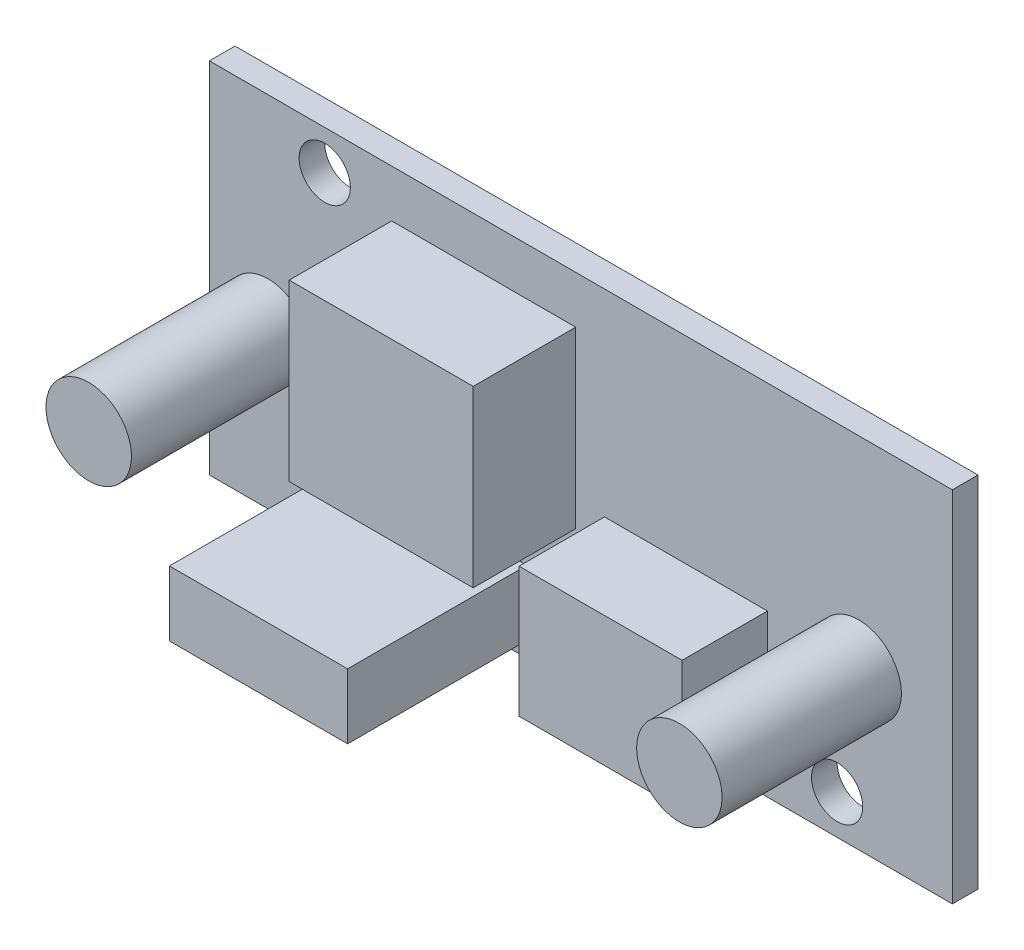
ISO-10303-21;
HEADER;
FILE_DESCRIPTION(('STEP AP214'),'2;1');
FILE_NAME('part.step','',(''),(''),'','','');
FILE_SCHEMA(('AUTOMOTIVE_DESIGN { 1 0 10303 214 1 1 1 1 }'));
ENDSEC;
DATA;
#1=APPLICATION_CONTEXT('core data for automotive mechanical design processes');
#2=APPLICATION_PROTOCOL_DEFINITION('international standard','automotive_design',2000,#1);
#3=PRODUCT_CONTEXT('',#1,'mechanical');
#4=PRODUCT('Part','Part','',(#3));
#5=PRODUCT_RELATED_PRODUCT_CATEGORY('part','',(#4));
#6=PRODUCT_DEFINITION_FORMATION('','',#4);
#7=PRODUCT_DEFINITION_CONTEXT('part definition',#1,'design');
#8=PRODUCT_DEFINITION('design','',#6,#7);
#9=PRODUCT_DEFINITION_SHAPE('','',#8);
#10=(LENGTH_UNIT() NAMED_UNIT(*) SI_UNIT(.MILLI.,.METRE.));
#11=(NAMED_UNIT(*) PLANE_ANGLE_UNIT() SI_UNIT($,.RADIAN.));
#12=(NAMED_UNIT(*) SI_UNIT($,.STERADIAN.) SOLID_ANGLE_UNIT());
#13=UNCERTAINTY_MEASURE_WITH_UNIT(LENGTH_MEASURE(1.E-05),#10,'distance_accuracy_value','');
#14=(GEOMETRIC_REPRESENTATION_CONTEXT(3) GLOBAL_UNCERTAINTY_ASSIGNED_CONTEXT((#13)) GLOBAL_UNIT_ASSIGNED_CONTEXT((#10,
#11,#12)) REPRESENTATION_CONTEXT('',''));
#15=CARTESIAN_POINT('',(0.,0.,0.));
#16=DIRECTION('',(0.,0.,1.));
#17=DIRECTION('',(1.,0.,0.));
#18=AXIS2_PLACEMENT_3D('',#15,#16,#17);
#19=CARTESIAN_POINT('',(0.,0.,1.5));
#20=DIRECTION('',(0.,0.,-1.));
#21=DIRECTION('',(-1.,0.,0.));
#22=AXIS2_PLACEMENT_3D('',#19,#20,#21);
#23=PLANE('',#22);
#24=DIRECTION('',(0.,-1.,0.));
#25=VECTOR('',#24,1.);
#26=CARTESIAN_POINT('',(10.6723495965989,18.2175320677435,1.5));
#27=LINE('',#26,#25);
#28=CARTESIAN_POINT('',(10.6723495965989,18.2175320677435,1.5));
#29=VERTEX_POINT('',#28);
#30=CARTESIAN_POINT('',(10.6723495965989,7.99909000588036,1.5));
#31=VERTEX_POINT('',#30);
#32=EDGE_CURVE('E169',#29,#31,#27,.T.);
#33=ORIENTED_EDGE('',*,*,#32,.F.);
#34=DIRECTION('',(-1.,0.,0.));
#35=VECTOR('',#34,1.);
#36=CARTESIAN_POINT('',(10.6723495965989,18.2175320677435,1.5));
#37=LINE('',#36,#35);
#38=CARTESIAN_POINT('',(21.4431398780221,18.2175320677435,1.5));
#39=VERTEX_POINT('',#38);
#40=EDGE_CURVE('E182',#39,#29,#37,.T.);
#41=ORIENTED_EDGE('',*,*,#40,.F.);
#42=DIRECTION('',(0.,1.,0.));
#43=VECTOR('',#42,1.);
#44=CARTESIAN_POINT('',(21.4431398780221,18.2175320677435,1.5));
#45=LINE('',#44,#43);
#46=CARTESIAN_POINT('',(21.4431398780221,7.99909000588036,1.5));
#47=VERTEX_POINT('',#46);
#48=EDGE_CURVE('E191',#47,#39,#45,.T.);
#49=ORIENTED_EDGE('',*,*,#48,.F.);
#50=DIRECTION('',(1.,0.,0.));
#51=VECTOR('',#50,1.);
#52=CARTESIAN_POINT('',(10.6723495965989,7.99909000588036,1.5));
#53=LINE('',#52,#51);
#54=EDGE_CURVE('E172',#31,#47,#53,.T.);
#55=ORIENTED_EDGE('',*,*,#54,.F.);
#56=EDGE_LOOP('',(#33,#41,#49,#55));
#57=FACE_BOUND('',#56,.T.);
#58=CARTESIAN_POINT('',(3.4304507179211,9.16515846939627,1.5));
#59=DIRECTION('',(0.,0.,-1.));
#60=DIRECTION('',(-1.,0.,0.));
#61=AXIS2_PLACEMENT_3D('',#58,#59,#60);
#62=CIRCLE('',#61,2.5);
#63=CARTESIAN_POINT('',(0.930450717921095,9.16515846939627,1.5));
#64=VERTEX_POINT('',#63);
#65=EDGE_CURVE('E43',#64,#64,#62,.F.);
#66=ORIENTED_EDGE('',*,*,#65,.F.);
#67=EDGE_LOOP('',(#66));
#68=FACE_BOUND('',#67,.T.);
#69=CARTESIAN_POINT('',(36.75,2.3,1.5));
#70=DIRECTION('',(0.,0.,1.));
#71=DIRECTION('',(1.,0.,0.));
#72=AXIS2_PLACEMENT_3D('',#69,#70,#71);
#73=CIRCLE('',#72,1.5);
#74=CARTESIAN_POINT('',(38.25,2.3,1.5));
#75=VERTEX_POINT('',#74);
#76=EDGE_CURVE('E247',#75,#75,#73,.T.);
#77=ORIENTED_EDGE('',*,*,#76,.F.);
#78=EDGE_LOOP('',(#77));
#79=FACE_BOUND('',#78,.T.);
#80=DIRECTION('',(0.,-1.,0.));
#81=VECTOR('',#80,1.);
#82=CARTESIAN_POINT('',(0.,0.,1.5));
#83=LINE('',#82,#81);
#84=CARTESIAN_POINT('',(0.,21.,1.5));
#85=VERTEX_POINT('',#84);
#86=CARTESIAN_POINT('',(0.,0.,1.5));
#87=VERTEX_POINT('',#86);
#88=EDGE_CURVE('E259',#85,#87,#83,.T.);
#89=ORIENTED_EDGE('',*,*,#88,.T.);
#90=DIRECTION('',(1.,0.,0.));
#91=VECTOR('',#90,1.);
#92=CARTESIAN_POINT('',(0.,0.,1.5));
#93=LINE('',#92,#91);
#94=CARTESIAN_POINT('',(43.5,0.,1.5));
#95=VERTEX_POINT('',#94);
#96=EDGE_CURVE('E262',#87,#95,#93,.T.);
#97=ORIENTED_EDGE('',*,*,#96,.T.);
#98=DIRECTION('',(0.,1.,0.));
#99=VECTOR('',#98,1.);
#100=CARTESIAN_POINT('',(43.5,0.,1.5));
#101=LINE('',#100,#99);
#102=CARTESIAN_POINT('',(43.5,21.,1.5));
#103=VERTEX_POINT('',#102);
#104=EDGE_CURVE('E265',#95,#103,#101,.T.);
#105=ORIENTED_EDGE('',*,*,#104,.T.);
#106=DIRECTION('',(-1.,0.,0.));
#107=VECTOR('',#106,1.);
#108=CARTESIAN_POINT('',(0.,21.,1.5));
#109=LINE('',#108,#107);
#110=EDGE_CURVE('E267',#103,#85,#109,.T.);
#111=ORIENTED_EDGE('',*,*,#110,.T.);
#112=EDGE_LOOP('',(#89,#97,#105,#111));
#113=FACE_BOUND('',#112,.T.);
#114=CARTESIAN_POINT('',(6.75,18.7,1.5));
#115=DIRECTION('',(0.,0.,1.));
#116=DIRECTION('',(1.,0.,0.));
#117=AXIS2_PLACEMENT_3D('',#114,#115,#116);
#118=CIRCLE('',#117,1.5);
#119=CARTESIAN_POINT('',(8.25,18.7,1.5));
#120=VERTEX_POINT('',#119);
#121=EDGE_CURVE('E253',#120,#120,#118,.T.);
#122=ORIENTED_EDGE('',*,*,#121,.F.);
#123=EDGE_LOOP('',(#122));
#124=FACE_BOUND('',#123,.T.);
#125=DIRECTION('',(0.,-1.,0.));
#126=VECTOR('',#125,1.);
#127=CARTESIAN_POINT('',(8.15609659638031,0.910621188191537,1.5));
#128=LINE('',#127,#126);
#129=CARTESIAN_POINT('',(8.15609659638031,4.71568670071714,1.5));
#130=VERTEX_POINT('',#129);
#131=CARTESIAN_POINT('',(8.15609659638031,0.910621188191537,1.5));
#132=VERTEX_POINT('',#131);
#133=EDGE_CURVE('E213',#130,#132,#128,.T.);
#134=ORIENTED_EDGE('',*,*,#133,.F.);
#135=DIRECTION('',(-1.,0.,0.));
#136=VECTOR('',#135,1.);
#137=CARTESIAN_POINT('',(8.15609659638031,4.71568670071714,1.5));
#138=LINE('',#137,#136);
#139=CARTESIAN_POINT('',(18.5893407436279,4.71568670071714,1.5));
#140=VERTEX_POINT('',#139);
#141=EDGE_CURVE('E218',#140,#130,#138,.T.);
#142=ORIENTED_EDGE('',*,*,#141,.F.);
#143=DIRECTION('',(0.,1.,0.));
#144=VECTOR('',#143,1.);
#145=CARTESIAN_POINT('',(18.5893407436279,0.910621188191537,1.5));
#146=LINE('',#145,#144);
#147=CARTESIAN_POINT('',(18.5893407436279,0.910621188191537,1.5));
#148=VERTEX_POINT('',#147);
#149=EDGE_CURVE('E230',#148,#140,#146,.T.);
#150=ORIENTED_EDGE('',*,*,#149,.F.);
#151=DIRECTION('',(1.,0.,0.));
#152=VECTOR('',#151,1.);
#153=CARTESIAN_POINT('',(8.15609659638031,0.910621188191537,1.5));
#154=LINE('',#153,#152);
#155=EDGE_CURVE('E227',#132,#148,#154,.T.);
#156=ORIENTED_EDGE('',*,*,#155,.F.);
#157=EDGE_LOOP('',(#134,#142,#150,#156));
#158=FACE_BOUND('',#157,.T.);
#159=CARTESIAN_POINT('',(38.0135864648272,9.16515846939627,1.5));
#160=DIRECTION('',(0.,0.,-1.));
#161=DIRECTION('',(-1.,0.,0.));
#162=AXIS2_PLACEMENT_3D('',#159,#160,#161);
#163=CIRCLE('',#162,2.5);
#164=CARTESIAN_POINT('',(35.5135864648272,9.16515846939627,1.5));
#165=VERTEX_POINT('',#164);
#166=EDGE_CURVE('E11',#165,#165,#163,.F.);
#167=ORIENTED_EDGE('',*,*,#166,.F.);
#168=EDGE_LOOP('',(#167));
#169=FACE_BOUND('',#168,.T.);
#170=DIRECTION('',(0.,-1.,0.));
#171=VECTOR('',#170,1.);
#172=CARTESIAN_POINT('',(23.1308705489004,9.44133257917635,1.5));
#173=LINE('',#172,#171);
#174=CARTESIAN_POINT('',(23.1308705489004,9.44133257917635,1.5));
#175=VERTEX_POINT('',#174);
#176=CARTESIAN_POINT('',(23.1308705489004,1.83120155412515,1.5));
#177=VERTEX_POINT('',#176);
#178=EDGE_CURVE('E168',#175,#177,#173,.T.);
#179=ORIENTED_EDGE('',*,*,#178,.F.);
#180=DIRECTION('',(-1.,0.,0.));
#181=VECTOR('',#180,1.);
#182=CARTESIAN_POINT('',(23.1308705489004,9.44133257917635,1.5));
#183=LINE('',#182,#181);
#184=CARTESIAN_POINT('',(32.6742203424122,9.44133257917635,1.5));
#185=VERTEX_POINT('',#184);
#186=EDGE_CURVE('E165',#185,#175,#183,.T.);
#187=ORIENTED_EDGE('',*,*,#186,.F.);
#188=DIRECTION('',(0.,1.,0.));
#189=VECTOR('',#188,1.);
#190=CARTESIAN_POINT('',(32.6742203424122,9.44133257917635,1.5));
#191=LINE('',#190,#189);
#192=CARTESIAN_POINT('',(32.6742203424122,1.83120155412515,1.5));
#193=VERTEX_POINT('',#192);
#194=EDGE_CURVE('E55',#193,#185,#191,.T.);
#195=ORIENTED_EDGE('',*,*,#194,.F.);
#196=DIRECTION('',(1.,0.,0.));
#197=VECTOR('',#196,1.);
#198=CARTESIAN_POINT('',(23.1308705489004,1.83120155412515,1.5));
#199=LINE('',#198,#197);
#200=EDGE_CURVE('E50',#177,#193,#199,.T.);
#201=ORIENTED_EDGE('',*,*,#200,.F.);
#202=EDGE_LOOP('',(#179,#187,#195,#201));
#203=FACE_BOUND('',#202,.T.);
#204=ADVANCED_FACE('F35',(#57,#68,#79,#113,#124,#158,#169,#203),#23,.F.);
#205=CARTESIAN_POINT('',(0.,0.,0.));
#206=DIRECTION('',(0.,0.,-1.));
#207=DIRECTION('',(-1.,0.,0.));
#208=AXIS2_PLACEMENT_3D('',#205,#206,#207);
#209=PLANE('',#208);
#210=CARTESIAN_POINT('',(6.75,18.7,0.));
#211=DIRECTION('',(0.,0.,1.));
#212=DIRECTION('',(1.,0.,0.));
#213=AXIS2_PLACEMENT_3D('',#210,#211,#212);
#214=CIRCLE('',#213,1.5);
#215=CARTESIAN_POINT('',(8.25,18.7,0.));
#216=VERTEX_POINT('',#215);
#217=EDGE_CURVE('E250',#216,#216,#214,.T.);
#218=ORIENTED_EDGE('',*,*,#217,.T.);
#219=EDGE_LOOP('',(#218));
#220=FACE_BOUND('',#219,.T.);
#221=DIRECTION('',(0.,-1.,0.));
#222=VECTOR('',#221,1.);
#223=CARTESIAN_POINT('',(0.,0.,0.));
#224=LINE('',#223,#222);
#225=CARTESIAN_POINT('',(0.,21.,0.));
#226=VERTEX_POINT('',#225);
#227=CARTESIAN_POINT('',(0.,0.,0.));
#228=VERTEX_POINT('',#227);
#229=EDGE_CURVE('E256',#226,#228,#224,.T.);
#230=ORIENTED_EDGE('',*,*,#229,.F.);
#231=DIRECTION('',(-1.,0.,0.));
#232=VECTOR('',#231,1.);
#233=CARTESIAN_POINT('',(0.,21.,0.));
#234=LINE('',#233,#232);
#235=CARTESIAN_POINT('',(43.5,21.,0.));
#236=VERTEX_POINT('',#235);
#237=EDGE_CURVE('E263',#236,#226,#234,.T.);
#238=ORIENTED_EDGE('',*,*,#237,.F.);
#239=DIRECTION('',(0.,1.,0.));
#240=VECTOR('',#239,1.);
#241=CARTESIAN_POINT('',(43.5,0.,0.));
#242=LINE('',#241,#240);
#243=CARTESIAN_POINT('',(43.5,0.,0.));
#244=VERTEX_POINT('',#243);
#245=EDGE_CURVE('E274',#244,#236,#242,.T.);
#246=ORIENTED_EDGE('',*,*,#245,.F.);
#247=DIRECTION('',(1.,0.,0.));
#248=VECTOR('',#247,1.);
#249=CARTESIAN_POINT('',(0.,0.,0.));
#250=LINE('',#249,#248);
#251=EDGE_CURVE('E272',#228,#244,#250,.T.);
#252=ORIENTED_EDGE('',*,*,#251,.F.);
#253=EDGE_LOOP('',(#230,#238,#246,#252));
#254=FACE_BOUND('',#253,.T.);
#255=CARTESIAN_POINT('',(36.75,2.3,0.));
#256=DIRECTION('',(0.,0.,1.));
#257=DIRECTION('',(1.,0.,0.));
#258=AXIS2_PLACEMENT_3D('',#255,#256,#257);
#259=CIRCLE('',#258,1.5);
#260=CARTESIAN_POINT('',(38.25,2.3,0.));
#261=VERTEX_POINT('',#260);
#262=EDGE_CURVE('E246',#261,#261,#259,.T.);
#263=ORIENTED_EDGE('',*,*,#262,.T.);
#264=EDGE_LOOP('',(#263));
#265=FACE_BOUND('',#264,.T.);
#266=ADVANCED_FACE('F294',(#220,#254,#265),#209,.T.);
#267=CARTESIAN_POINT('',(0.,0.,1.5));
#268=DIRECTION('',(1.,0.,0.));
#269=DIRECTION('',(0.,0.,-1.));
#270=AXIS2_PLACEMENT_3D('',#267,#268,#269);
#271=PLANE('',#270);
#272=ORIENTED_EDGE('',*,*,#229,.T.);
#273=DIRECTION('',(0.,0.,-1.));
#274=VECTOR('',#273,1.);
#275=CARTESIAN_POINT('',(0.,0.,1.5));
#276=LINE('',#275,#274);
#277=EDGE_CURVE('E285',#87,#228,#276,.T.);
#278=ORIENTED_EDGE('',*,*,#277,.F.);
#279=ORIENTED_EDGE('',*,*,#88,.F.);
#280=DIRECTION('',(0.,0.,-1.));
#281=VECTOR('',#280,1.);
#282=CARTESIAN_POINT('',(0.,21.,1.5));
#283=LINE('',#282,#281);
#284=EDGE_CURVE('E269',#85,#226,#283,.T.);
#285=ORIENTED_EDGE('',*,*,#284,.T.);
#286=EDGE_LOOP('',(#272,#278,#279,#285));
#287=FACE_BOUND('',#286,.T.);
#288=ADVANCED_FACE('F37',(#287),#271,.F.);
#289=CARTESIAN_POINT('',(0.,0.,1.5));
#290=DIRECTION('',(0.,1.,0.));
#291=DIRECTION('',(0.,0.,1.));
#292=AXIS2_PLACEMENT_3D('',#289,#290,#291);
#293=PLANE('',#292);
#294=ORIENTED_EDGE('',*,*,#251,.T.);
#295=DIRECTION('',(0.,0.,-1.));
#296=VECTOR('',#295,1.);
#297=CARTESIAN_POINT('',(43.5,0.,1.5));
#298=LINE('',#297,#296);
#299=EDGE_CURVE('E282',#95,#244,#298,.T.);
#300=ORIENTED_EDGE('',*,*,#299,.F.);
#301=ORIENTED_EDGE('',*,*,#96,.F.);
#302=ORIENTED_EDGE('',*,*,#277,.T.);
#303=EDGE_LOOP('',(#294,#300,#301,#302));
#304=FACE_BOUND('',#303,.T.);
#305=ADVANCED_FACE('F405',(#304),#293,.F.);
#306=CARTESIAN_POINT('',(43.5,0.,1.5));
#307=DIRECTION('',(-1.,0.,0.));
#308=DIRECTION('',(0.,0.,1.));
#309=AXIS2_PLACEMENT_3D('',#306,#307,#308);
#310=PLANE('',#309);
#311=ORIENTED_EDGE('',*,*,#245,.T.);
#312=DIRECTION('',(0.,0.,-1.));
#313=VECTOR('',#312,1.);
#314=CARTESIAN_POINT('',(43.5,21.,1.5));
#315=LINE('',#314,#313);
#316=EDGE_CURVE('E279',#103,#236,#315,.T.);
#317=ORIENTED_EDGE('',*,*,#316,.F.);
#318=ORIENTED_EDGE('',*,*,#104,.F.);
#319=ORIENTED_EDGE('',*,*,#299,.T.);
#320=EDGE_LOOP('',(#311,#317,#318,#319));
#321=FACE_BOUND('',#320,.T.);
#322=ADVANCED_FACE('F402',(#321),#310,.F.);
#323=CARTESIAN_POINT('',(0.,21.,1.5));
#324=DIRECTION('',(0.,-1.,0.));
#325=DIRECTION('',(0.,0.,-1.));
#326=AXIS2_PLACEMENT_3D('',#323,#324,#325);
#327=PLANE('',#326);
#328=ORIENTED_EDGE('',*,*,#237,.T.);
#329=ORIENTED_EDGE('',*,*,#284,.F.);
#330=ORIENTED_EDGE('',*,*,#110,.F.);
#331=ORIENTED_EDGE('',*,*,#316,.T.);
#332=EDGE_LOOP('',(#328,#329,#330,#331));
#333=FACE_BOUND('',#332,.T.);
#334=ADVANCED_FACE('F394',(#333),#327,.F.);
#335=CARTESIAN_POINT('',(6.75,18.7,1.5));
#336=DIRECTION('',(0.,0.,-1.));
#337=DIRECTION('',(-1.,0.,0.));
#338=AXIS2_PLACEMENT_3D('',#335,#336,#337);
#339=CYLINDRICAL_SURFACE('',#338,1.5);
#340=ORIENTED_EDGE('',*,*,#121,.T.);
#341=EDGE_LOOP('',(#340));
#342=FACE_BOUND('',#341,.T.);
#343=ORIENTED_EDGE('',*,*,#217,.F.);
#344=EDGE_LOOP('',(#343));
#345=FACE_BOUND('',#344,.T.);
#346=ADVANCED_FACE('F391',(#342,#345),#339,.F.);
#347=CARTESIAN_POINT('',(36.75,2.3,1.5));
#348=DIRECTION('',(0.,0.,-1.));
#349=DIRECTION('',(-1.,0.,0.));
#350=AXIS2_PLACEMENT_3D('',#347,#348,#349);
#351=CYLINDRICAL_SURFACE('',#350,1.5);
#352=ORIENTED_EDGE('',*,*,#76,.T.);
#353=EDGE_LOOP('',(#352));
#354=FACE_BOUND('',#353,.T.);
#355=ORIENTED_EDGE('',*,*,#262,.F.);
#356=EDGE_LOOP('',(#355));
#357=FACE_BOUND('',#356,.T.);
#358=ADVANCED_FACE('F387',(#354,#357),#351,.F.);
#359=CARTESIAN_POINT('',(8.15609659638031,0.910621188191537,12.));
#360=DIRECTION('',(1.,0.,0.));
#361=DIRECTION('',(0.,0.,-1.));
#362=AXIS2_PLACEMENT_3D('',#359,#360,#361);
#363=PLANE('',#362);
#364=ORIENTED_EDGE('',*,*,#133,.T.);
#365=DIRECTION('',(0.,0.,-1.));
#366=VECTOR('',#365,1.);
#367=CARTESIAN_POINT('',(8.15609659638031,0.910621188191537,12.));
#368=LINE('',#367,#366);
#369=CARTESIAN_POINT('',(8.15609659638031,0.910621188191537,12.));
#370=VERTEX_POINT('',#369);
#371=EDGE_CURVE('E243',#370,#132,#368,.T.);
#372=ORIENTED_EDGE('',*,*,#371,.F.);
#373=DIRECTION('',(0.,-1.,0.));
#374=VECTOR('',#373,1.);
#375=CARTESIAN_POINT('',(8.15609659638031,0.910621188191537,12.));
#376=LINE('',#375,#374);
#377=CARTESIAN_POINT('',(8.15609659638031,4.71568670071714,12.));
#378=VERTEX_POINT('',#377);
#379=EDGE_CURVE('E214',#378,#370,#376,.T.);
#380=ORIENTED_EDGE('',*,*,#379,.F.);
#381=DIRECTION('',(0.,0.,-1.));
#382=VECTOR('',#381,1.);
#383=CARTESIAN_POINT('',(8.15609659638031,4.71568670071714,12.));
#384=LINE('',#383,#382);
#385=EDGE_CURVE('E224',#378,#130,#384,.T.);
#386=ORIENTED_EDGE('',*,*,#385,.T.);
#387=EDGE_LOOP('',(#364,#372,#380,#386));
#388=FACE_BOUND('',#387,.T.);
#389=ADVANCED_FACE('F383',(#388),#363,.F.);
#390=CARTESIAN_POINT('',(8.15609659638031,0.910621188191537,12.));
#391=DIRECTION('',(0.,1.,0.));
#392=DIRECTION('',(0.,0.,1.));
#393=AXIS2_PLACEMENT_3D('',#390,#391,#392);
#394=PLANE('',#393);
#395=ORIENTED_EDGE('',*,*,#155,.T.);
#396=DIRECTION('',(0.,0.,-1.));
#397=VECTOR('',#396,1.);
#398=CARTESIAN_POINT('',(18.5893407436279,0.910621188191537,12.));
#399=LINE('',#398,#397);
#400=CARTESIAN_POINT('',(18.5893407436279,0.910621188191537,12.));
#401=VERTEX_POINT('',#400);
#402=EDGE_CURVE('E240',#401,#148,#399,.T.);
#403=ORIENTED_EDGE('',*,*,#402,.F.);
#404=DIRECTION('',(1.,0.,0.));
#405=VECTOR('',#404,1.);
#406=CARTESIAN_POINT('',(8.15609659638031,0.910621188191537,12.));
#407=LINE('',#406,#405);
#408=EDGE_CURVE('E217',#370,#401,#407,.T.);
#409=ORIENTED_EDGE('',*,*,#408,.F.);
#410=ORIENTED_EDGE('',*,*,#371,.T.);
#411=EDGE_LOOP('',(#395,#403,#409,#410));
#412=FACE_BOUND('',#411,.T.);
#413=ADVANCED_FACE('F379',(#412),#394,.F.);
#414=CARTESIAN_POINT('',(18.5893407436279,0.910621188191537,12.));
#415=DIRECTION('',(-1.,0.,0.));
#416=DIRECTION('',(0.,0.,1.));
#417=AXIS2_PLACEMENT_3D('',#414,#415,#416);
#418=PLANE('',#417);
#419=ORIENTED_EDGE('',*,*,#149,.T.);
#420=DIRECTION('',(0.,0.,-1.));
#421=VECTOR('',#420,1.);
#422=CARTESIAN_POINT('',(18.5893407436279,4.71568670071714,12.));
#423=LINE('',#422,#421);
#424=CARTESIAN_POINT('',(18.5893407436279,4.71568670071714,12.));
#425=VERTEX_POINT('',#424);
#426=EDGE_CURVE('E237',#425,#140,#423,.T.);
#427=ORIENTED_EDGE('',*,*,#426,.F.);
#428=DIRECTION('',(0.,1.,0.));
#429=VECTOR('',#428,1.);
#430=CARTESIAN_POINT('',(18.5893407436279,0.910621188191537,12.));
#431=LINE('',#430,#429);
#432=EDGE_CURVE('E220',#401,#425,#431,.T.);
#433=ORIENTED_EDGE('',*,*,#432,.F.);
#434=ORIENTED_EDGE('',*,*,#402,.T.);
#435=EDGE_LOOP('',(#419,#427,#433,#434));
#436=FACE_BOUND('',#435,.T.);
#437=ADVANCED_FACE('F375',(#436),#418,.F.);
#438=CARTESIAN_POINT('',(8.15609659638031,4.71568670071714,12.));
#439=DIRECTION('',(0.,-1.,0.));
#440=DIRECTION('',(0.,0.,-1.));
#441=AXIS2_PLACEMENT_3D('',#438,#439,#440);
#442=PLANE('',#441);
#443=ORIENTED_EDGE('',*,*,#141,.T.);
#444=ORIENTED_EDGE('',*,*,#385,.F.);
#445=DIRECTION('',(-1.,0.,0.));
#446=VECTOR('',#445,1.);
#447=CARTESIAN_POINT('',(8.15609659638031,4.71568670071714,12.));
#448=LINE('',#447,#446);
#449=EDGE_CURVE('E222',#425,#378,#448,.T.);
#450=ORIENTED_EDGE('',*,*,#449,.F.);
#451=ORIENTED_EDGE('',*,*,#426,.T.);
#452=EDGE_LOOP('',(#443,#444,#450,#451));
#453=FACE_BOUND('',#452,.T.);
#454=ADVANCED_FACE('F371',(#453),#442,.F.);
#455=CARTESIAN_POINT('',(0.,0.,12.));
#456=DIRECTION('',(0.,0.,-1.));
#457=DIRECTION('',(-1.,0.,0.));
#458=AXIS2_PLACEMENT_3D('',#455,#456,#457);
#459=PLANE('',#458);
#460=ORIENTED_EDGE('',*,*,#379,.T.);
#461=ORIENTED_EDGE('',*,*,#408,.T.);
#462=ORIENTED_EDGE('',*,*,#432,.T.);
#463=ORIENTED_EDGE('',*,*,#449,.T.);
#464=EDGE_LOOP('',(#460,#461,#462,#463));
#465=FACE_BOUND('',#464,.T.);
#466=ADVANCED_FACE('F367',(#465),#459,.F.);
#467=CARTESIAN_POINT('',(3.4304507179211,9.16515846939627,12.));
#468=DIRECTION('',(0.,0.,-1.));
#469=DIRECTION('',(-1.,0.,0.));
#470=AXIS2_PLACEMENT_3D('',#467,#468,#469);
#471=CYLINDRICAL_SURFACE('',#470,2.5);
#472=CARTESIAN_POINT('',(3.4304507179211,9.16515846939627,12.));
#473=DIRECTION('',(0.,0.,1.));
#474=DIRECTION('',(1.,0.,0.));
#475=AXIS2_PLACEMENT_3D('',#472,#473,#474);
#476=CIRCLE('',#475,2.5);
#477=CARTESIAN_POINT('',(0.930450717921095,9.16515846939627,12.));
#478=VERTEX_POINT('',#477);
#479=EDGE_CURVE('E210',#478,#478,#476,.T.);
#480=CARTESIAN_POINT('',(0.930450717921095,9.16515846939627,12.));
#481=CARTESIAN_POINT('',(0.930450717921095,9.16515846939627,11.890625));
#482=CARTESIAN_POINT('',(0.930450717921095,9.16515846939627,11.78125));
#483=CARTESIAN_POINT('',(0.930450717921095,9.16515846939627,11.5625));
#484=CARTESIAN_POINT('',(0.930450717921095,9.16515846939627,11.453125));
#485=CARTESIAN_POINT('',(0.930450717921095,9.16515846939627,11.234375));
#486=CARTESIAN_POINT('',(0.930450717921095,9.16515846939627,11.125));
#487=CARTESIAN_POINT('',(0.930450717921095,9.16515846939627,10.90625));
#488=CARTESIAN_POINT('',(0.930450717921095,9.16515846939627,10.796875));
#489=CARTESIAN_POINT('',(0.930450717921095,9.16515846939627,10.578125));
#490=CARTESIAN_POINT('',(0.930450717921095,9.16515846939627,10.46875));
#491=CARTESIAN_POINT('',(0.930450717921095,9.16515846939627,10.25));
#492=CARTESIAN_POINT('',(0.930450717921095,9.16515846939627,10.140625));
#493=CARTESIAN_POINT('',(0.930450717921095,9.16515846939627,9.921875));
#494=CARTESIAN_POINT('',(0.930450717921095,9.16515846939627,9.8125));
#495=CARTESIAN_POINT('',(0.930450717921095,9.16515846939627,9.59375));
#496=CARTESIAN_POINT('',(0.930450717921095,9.16515846939627,9.484375));
#497=CARTESIAN_POINT('',(0.930450717921095,9.16515846939627,9.265625));
#498=CARTESIAN_POINT('',(0.930450717921095,9.16515846939627,9.15625));
#499=CARTESIAN_POINT('',(0.930450717921095,9.16515846939627,8.9375));
#500=CARTESIAN_POINT('',(0.930450717921095,9.16515846939627,8.828125));
#501=CARTESIAN_POINT('',(0.930450717921095,9.16515846939627,8.609375));
#502=CARTESIAN_POINT('',(0.930450717921095,9.16515846939627,8.5));
#503=CARTESIAN_POINT('',(0.930450717921095,9.16515846939627,8.28125));
#504=CARTESIAN_POINT('',(0.930450717921095,9.16515846939627,8.171875));
#505=CARTESIAN_POINT('',(0.930450717921095,9.16515846939627,7.953125));
#506=CARTESIAN_POINT('',(0.930450717921095,9.16515846939627,7.84375));
#507=CARTESIAN_POINT('',(0.930450717921095,9.16515846939627,7.625));
#508=CARTESIAN_POINT('',(0.930450717921095,9.16515846939627,7.515625));
#509=CARTESIAN_POINT('',(0.930450717921095,9.16515846939627,7.296875));
#510=CARTESIAN_POINT('',(0.930450717921095,9.16515846939627,7.1875));
#511=CARTESIAN_POINT('',(0.930450717921095,9.16515846939627,6.96875));
#512=CARTESIAN_POINT('',(0.930450717921095,9.16515846939627,6.859375));
#513=CARTESIAN_POINT('',(0.930450717921095,9.16515846939627,6.640625));
#514=CARTESIAN_POINT('',(0.930450717921095,9.16515846939627,6.53125));
#515=CARTESIAN_POINT('',(0.930450717921095,9.16515846939627,6.3125));
#516=CARTESIAN_POINT('',(0.930450717921095,9.16515846939627,6.203125));
#517=CARTESIAN_POINT('',(0.930450717921095,9.16515846939627,5.984375));
#518=CARTESIAN_POINT('',(0.930450717921095,9.16515846939627,5.875));
#519=CARTESIAN_POINT('',(0.930450717921095,9.16515846939627,5.65625));
#520=CARTESIAN_POINT('',(0.930450717921095,9.16515846939627,5.546875));
#521=CARTESIAN_POINT('',(0.930450717921095,9.16515846939627,5.328125));
#522=CARTESIAN_POINT('',(0.930450717921095,9.16515846939627,5.21875));
#523=CARTESIAN_POINT('',(0.930450717921095,9.16515846939627,5.));
#524=CARTESIAN_POINT('',(0.930450717921095,9.16515846939627,4.890625));
#525=CARTESIAN_POINT('',(0.930450717921095,9.16515846939627,4.671875));
#526=CARTESIAN_POINT('',(0.930450717921095,9.16515846939627,4.5625));
#527=CARTESIAN_POINT('',(0.930450717921095,9.16515846939627,4.34375));
#528=CARTESIAN_POINT('',(0.930450717921095,9.16515846939627,4.234375));
#529=CARTESIAN_POINT('',(0.930450717921095,9.16515846939627,4.015625));
#530=CARTESIAN_POINT('',(0.930450717921095,9.16515846939627,3.90625));
#531=CARTESIAN_POINT('',(0.930450717921095,9.16515846939627,3.6875));
#532=CARTESIAN_POINT('',(0.930450717921095,9.16515846939627,3.578125));
#533=CARTESIAN_POINT('',(0.930450717921095,9.16515846939627,3.359375));
#534=CARTESIAN_POINT('',(0.930450717921095,9.16515846939627,3.25));
#535=CARTESIAN_POINT('',(0.930450717921095,9.16515846939627,3.03125));
#536=CARTESIAN_POINT('',(0.930450717921095,9.16515846939627,2.921875));
#537=CARTESIAN_POINT('',(0.930450717921095,9.16515846939627,2.703125));
#538=CARTESIAN_POINT('',(0.930450717921095,9.16515846939627,2.59375));
#539=CARTESIAN_POINT('',(0.930450717921095,9.16515846939627,2.375));
#540=CARTESIAN_POINT('',(0.930450717921095,9.16515846939627,2.265625));
#541=CARTESIAN_POINT('',(0.930450717921095,9.16515846939627,2.046875));
#542=CARTESIAN_POINT('',(0.930450717921095,9.16515846939627,1.9375));
#543=CARTESIAN_POINT('',(0.930450717921095,9.16515846939627,1.71875));
#544=CARTESIAN_POINT('',(0.930450717921095,9.16515846939627,1.609375));
#545=CARTESIAN_POINT('',(0.930450717921095,9.16515846939627,1.5));
#546=B_SPLINE_CURVE_WITH_KNOTS('',3,(#480,#481,#482,#483,#484,#485,#486,#487,#488,#489,#490,
#491,#492,#493,#494,#495,#496,#497,#498,#499,#500,#501,#502,#503,#504,#505,#506,#507,#508,#509,
#510,#511,#512,#513,#514,#515,#516,#517,#518,#519,#520,#521,#522,#523,#524,#525,#526,#527,#528,
#529,#530,#531,#532,#533,#534,#535,#536,#537,#538,#539,#540,#541,#542,#543,#544,#545),
.UNSPECIFIED.,.F.,.F.,(4,2,2,2,2,2,2,2,2,2,2,2,2,2,2,2,2,2,2,2,2,2,2,2,2,2,2,2,2,2,2,2,4),(0.,
0.328125,0.656250000000001,0.984375000000001,1.3125,1.640625,1.96875,2.296875,2.625,2.953125,
3.28125,3.609375,3.9375,4.265625,4.59375,4.921875,5.25,5.578125,5.90625,6.234375,6.5625,
6.890625,7.21875,7.546875,7.875,8.203125,8.53125,8.859375,9.1875,9.515625,9.84375,10.171875,
10.5),.UNSPECIFIED.);
#547=EDGE_CURVE('BSEAM290',#478,#64,#546,.T.);
#548=ORIENTED_EDGE('',*,*,#479,.F.);
#549=ORIENTED_EDGE('',*,*,#65,.T.);
#550=ORIENTED_EDGE('',*,*,#547,.T.);
#551=ORIENTED_EDGE('',*,*,#547,.F.);
#552=EDGE_LOOP('',(#548,#550,#549,#551));
#553=FACE_BOUND('',#552,.T.);
#554=ADVANCED_FACE('F290',(#553),#471,.T.);
#555=CARTESIAN_POINT('',(3.4304507179211,9.16515846939627,12.));
#556=DIRECTION('',(0.,0.,1.));
#557=DIRECTION('',(1.,0.,0.));
#558=AXIS2_PLACEMENT_3D('',#555,#556,#557);
#559=PLANE('',#558);
#560=ORIENTED_EDGE('',*,*,#479,.T.);
#561=EDGE_LOOP('',(#560));
#562=FACE_BOUND('',#561,.T.);
#563=ADVANCED_FACE('F360',(#562),#559,.T.);
#564=CARTESIAN_POINT('',(38.0135864648272,9.16515846939627,12.));
#565=DIRECTION('',(0.,0.,-1.));
#566=DIRECTION('',(-1.,0.,0.));
#567=AXIS2_PLACEMENT_3D('',#564,#565,#566);
#568=CYLINDRICAL_SURFACE('',#567,2.5);
#569=CARTESIAN_POINT('',(38.0135864648272,9.16515846939627,12.));
#570=DIRECTION('',(0.,0.,1.));
#571=DIRECTION('',(1.,0.,0.));
#572=AXIS2_PLACEMENT_3D('',#569,#570,#571);
#573=CIRCLE('',#572,2.5);
#574=CARTESIAN_POINT('',(35.5135864648272,9.16515846939627,12.));
#575=VERTEX_POINT('',#574);
#576=EDGE_CURVE('E207',#575,#575,#573,.T.);
#577=CARTESIAN_POINT('',(35.5135864648272,9.16515846939627,12.));
#578=CARTESIAN_POINT('',(35.5135864648272,9.16515846939627,11.890625));
#579=CARTESIAN_POINT('',(35.5135864648272,9.16515846939627,11.78125));
#580=CARTESIAN_POINT('',(35.5135864648272,9.16515846939627,11.5625));
#581=CARTESIAN_POINT('',(35.5135864648272,9.16515846939627,11.453125));
#582=CARTESIAN_POINT('',(35.5135864648272,9.16515846939627,11.234375));
#583=CARTESIAN_POINT('',(35.5135864648272,9.16515846939627,11.125));
#584=CARTESIAN_POINT('',(35.5135864648272,9.16515846939627,10.90625));
#585=CARTESIAN_POINT('',(35.5135864648272,9.16515846939627,10.796875));
#586=CARTESIAN_POINT('',(35.5135864648272,9.16515846939627,10.578125));
#587=CARTESIAN_POINT('',(35.5135864648272,9.16515846939627,10.46875));
#588=CARTESIAN_POINT('',(35.5135864648272,9.16515846939627,10.25));
#589=CARTESIAN_POINT('',(35.5135864648272,9.16515846939627,10.140625));
#590=CARTESIAN_POINT('',(35.5135864648272,9.16515846939627,9.921875));
#591=CARTESIAN_POINT('',(35.5135864648272,9.16515846939627,9.8125));
#592=CARTESIAN_POINT('',(35.5135864648272,9.16515846939627,9.59375));
#593=CARTESIAN_POINT('',(35.5135864648272,9.16515846939627,9.484375));
#594=CARTESIAN_POINT('',(35.5135864648272,9.16515846939627,9.265625));
#595=CARTESIAN_POINT('',(35.5135864648272,9.16515846939627,9.15625));
#596=CARTESIAN_POINT('',(35.5135864648272,9.16515846939627,8.9375));
#597=CARTESIAN_POINT('',(35.5135864648272,9.16515846939627,8.828125));
#598=CARTESIAN_POINT('',(35.5135864648272,9.16515846939627,8.609375));
#599=CARTESIAN_POINT('',(35.5135864648272,9.16515846939627,8.5));
#600=CARTESIAN_POINT('',(35.5135864648272,9.16515846939627,8.28125));
#601=CARTESIAN_POINT('',(35.5135864648272,9.16515846939627,8.171875));
#602=CARTESIAN_POINT('',(35.5135864648272,9.16515846939627,7.953125));
#603=CARTESIAN_POINT('',(35.5135864648272,9.16515846939627,7.84375));
#604=CARTESIAN_POINT('',(35.5135864648272,9.16515846939627,7.625));
#605=CARTESIAN_POINT('',(35.5135864648272,9.16515846939627,7.515625));
#606=CARTESIAN_POINT('',(35.5135864648272,9.16515846939627,7.296875));
#607=CARTESIAN_POINT('',(35.5135864648272,9.16515846939627,7.1875));
#608=CARTESIAN_POINT('',(35.5135864648272,9.16515846939627,6.96875));
#609=CARTESIAN_POINT('',(35.5135864648272,9.16515846939627,6.859375));
#610=CARTESIAN_POINT('',(35.5135864648272,9.16515846939627,6.640625));
#611=CARTESIAN_POINT('',(35.5135864648272,9.16515846939627,6.53125));
#612=CARTESIAN_POINT('',(35.5135864648272,9.16515846939627,6.3125));
#613=CARTESIAN_POINT('',(35.5135864648272,9.16515846939627,6.203125));
#614=CARTESIAN_POINT('',(35.5135864648272,9.16515846939627,5.984375));
#615=CARTESIAN_POINT('',(35.5135864648272,9.16515846939627,5.875));
#616=CARTESIAN_POINT('',(35.5135864648272,9.16515846939627,5.65625));
#617=CARTESIAN_POINT('',(35.5135864648272,9.16515846939627,5.546875));
#618=CARTESIAN_POINT('',(35.5135864648272,9.16515846939627,5.328125));
#619=CARTESIAN_POINT('',(35.5135864648272,9.16515846939627,5.21875));
#620=CARTESIAN_POINT('',(35.5135864648272,9.16515846939627,5.));
#621=CARTESIAN_POINT('',(35.5135864648272,9.16515846939627,4.890625));
#622=CARTESIAN_POINT('',(35.5135864648272,9.16515846939627,4.671875));
#623=CARTESIAN_POINT('',(35.5135864648272,9.16515846939627,4.5625));
#624=CARTESIAN_POINT('',(35.5135864648272,9.16515846939627,4.34375));
#625=CARTESIAN_POINT('',(35.5135864648272,9.16515846939627,4.234375));
#626=CARTESIAN_POINT('',(35.5135864648272,9.16515846939627,4.015625));
#627=CARTESIAN_POINT('',(35.5135864648272,9.16515846939627,3.90625));
#628=CARTESIAN_POINT('',(35.5135864648272,9.16515846939627,3.6875));
#629=CARTESIAN_POINT('',(35.5135864648272,9.16515846939627,3.578125));
#630=CARTESIAN_POINT('',(35.5135864648272,9.16515846939627,3.359375));
#631=CARTESIAN_POINT('',(35.5135864648272,9.16515846939627,3.25));
#632=CARTESIAN_POINT('',(35.5135864648272,9.16515846939627,3.03125));
#633=CARTESIAN_POINT('',(35.5135864648272,9.16515846939627,2.921875));
#634=CARTESIAN_POINT('',(35.5135864648272,9.16515846939627,2.703125));
#635=CARTESIAN_POINT('',(35.5135864648272,9.16515846939627,2.59375));
#636=CARTESIAN_POINT('',(35.5135864648272,9.16515846939627,2.375));
#637=CARTESIAN_POINT('',(35.5135864648272,9.16515846939627,2.265625));
#638=CARTESIAN_POINT('',(35.5135864648272,9.16515846939627,2.046875));
#639=CARTESIAN_POINT('',(35.5135864648272,9.16515846939627,1.9375));
#640=CARTESIAN_POINT('',(35.5135864648272,9.16515846939627,1.71875));
#641=CARTESIAN_POINT('',(35.5135864648272,9.16515846939627,1.609375));
#642=CARTESIAN_POINT('',(35.5135864648272,9.16515846939627,1.5));
#643=B_SPLINE_CURVE_WITH_KNOTS('',3,(#577,#578,#579,#580,#581,#582,#583,#584,#585,#586,#587,
#588,#589,#590,#591,#592,#593,#594,#595,#596,#597,#598,#599,#600,#601,#602,#603,#604,#605,#606,
#607,#608,#609,#610,#611,#612,#613,#614,#615,#616,#617,#618,#619,#620,#621,#622,#623,#624,#625,
#626,#627,#628,#629,#630,#631,#632,#633,#634,#635,#636,#637,#638,#639,#640,#641,#642),
.UNSPECIFIED.,.F.,.F.,(4,2,2,2,2,2,2,2,2,2,2,2,2,2,2,2,2,2,2,2,2,2,2,2,2,2,2,2,2,2,2,2,4),(0.,
0.328125,0.656250000000001,0.984375000000001,1.3125,1.640625,1.96875,2.296875,2.625,2.953125,
3.28125,3.609375,3.9375,4.265625,4.59375,4.921875,5.25,5.578125,5.90625,6.234375,6.5625,
6.890625,7.21875,7.546875,7.875,8.203125,8.53125,8.859375,9.1875,9.515625,9.84375,10.171875,
10.5),.UNSPECIFIED.);
#644=EDGE_CURVE('BSEAM356',#575,#165,#643,.T.);
#645=ORIENTED_EDGE('',*,*,#576,.F.);
#646=ORIENTED_EDGE('',*,*,#166,.T.);
#647=ORIENTED_EDGE('',*,*,#644,.T.);
#648=ORIENTED_EDGE('',*,*,#644,.F.);
#649=EDGE_LOOP('',(#645,#647,#646,#648));
#650=FACE_BOUND('',#649,.T.);
#651=ADVANCED_FACE('F356',(#650),#568,.T.);
#652=CARTESIAN_POINT('',(38.0135864648272,9.16515846939627,12.));
#653=DIRECTION('',(0.,0.,1.));
#654=DIRECTION('',(1.,0.,0.));
#655=AXIS2_PLACEMENT_3D('',#652,#653,#654);
#656=PLANE('',#655);
#657=ORIENTED_EDGE('',*,*,#576,.T.);
#658=EDGE_LOOP('',(#657));
#659=FACE_BOUND('',#658,.T.);
#660=ADVANCED_FACE('F352',(#659),#656,.T.);
#661=CARTESIAN_POINT('',(10.6723495965989,18.2175320677435,7.5));
#662=DIRECTION('',(1.,0.,0.));
#663=DIRECTION('',(0.,0.,-1.));
#664=AXIS2_PLACEMENT_3D('',#661,#662,#663);
#665=PLANE('',#664);
#666=ORIENTED_EDGE('',*,*,#32,.T.);
#667=DIRECTION('',(0.,0.,-1.));
#668=VECTOR('',#667,1.);
#669=CARTESIAN_POINT('',(10.6723495965989,7.99909000588036,7.5));
#670=LINE('',#669,#668);
#671=CARTESIAN_POINT('',(10.6723495965989,7.99909000588036,7.5));
#672=VERTEX_POINT('',#671);
#673=EDGE_CURVE('E204',#672,#31,#670,.T.);
#674=ORIENTED_EDGE('',*,*,#673,.F.);
#675=DIRECTION('',(0.,-1.,0.));
#676=VECTOR('',#675,1.);
#677=CARTESIAN_POINT('',(10.6723495965989,18.2175320677435,7.5));
#678=LINE('',#677,#676);
#679=CARTESIAN_POINT('',(10.6723495965989,18.2175320677435,7.5));
#680=VERTEX_POINT('',#679);
#681=EDGE_CURVE('E178',#680,#672,#678,.T.);
#682=ORIENTED_EDGE('',*,*,#681,.F.);
#683=DIRECTION('',(0.,0.,-1.));
#684=VECTOR('',#683,1.);
#685=CARTESIAN_POINT('',(10.6723495965989,18.2175320677435,7.5));
#686=LINE('',#685,#684);
#687=EDGE_CURVE('E187',#680,#29,#686,.T.);
#688=ORIENTED_EDGE('',*,*,#687,.T.);
#689=EDGE_LOOP('',(#666,#674,#682,#688));
#690=FACE_BOUND('',#689,.T.);
#691=ADVANCED_FACE('F348',(#690),#665,.F.);
#692=CARTESIAN_POINT('',(10.6723495965989,7.99909000588036,7.5));
#693=DIRECTION('',(0.,1.,0.));
#694=DIRECTION('',(0.,0.,1.));
#695=AXIS2_PLACEMENT_3D('',#692,#693,#694);
#696=PLANE('',#695);
#697=ORIENTED_EDGE('',*,*,#54,.T.);
#698=DIRECTION('',(0.,0.,-1.));
#699=VECTOR('',#698,1.);
#700=CARTESIAN_POINT('',(21.4431398780221,7.99909000588036,7.5));
#701=LINE('',#700,#699);
#702=CARTESIAN_POINT('',(21.4431398780221,7.99909000588036,7.5));
#703=VERTEX_POINT('',#702);
#704=EDGE_CURVE('E201',#703,#47,#701,.T.);
#705=ORIENTED_EDGE('',*,*,#704,.F.);
#706=DIRECTION('',(1.,0.,0.));
#707=VECTOR('',#706,1.);
#708=CARTESIAN_POINT('',(10.6723495965989,7.99909000588036,7.5));
#709=LINE('',#708,#707);
#710=EDGE_CURVE('E181',#672,#703,#709,.T.);
#711=ORIENTED_EDGE('',*,*,#710,.F.);
#712=ORIENTED_EDGE('',*,*,#673,.T.);
#713=EDGE_LOOP('',(#697,#705,#711,#712));
#714=FACE_BOUND('',#713,.T.);
#715=ADVANCED_FACE('F344',(#714),#696,.F.);
#716=CARTESIAN_POINT('',(21.4431398780221,18.2175320677435,7.5));
#717=DIRECTION('',(-1.,0.,0.));
#718=DIRECTION('',(0.,0.,1.));
#719=AXIS2_PLACEMENT_3D('',#716,#717,#718);
#720=PLANE('',#719);
#721=ORIENTED_EDGE('',*,*,#48,.T.);
#722=DIRECTION('',(0.,0.,-1.));
#723=VECTOR('',#722,1.);
#724=CARTESIAN_POINT('',(21.4431398780221,18.2175320677435,7.5));
#725=LINE('',#724,#723);
#726=CARTESIAN_POINT('',(21.4431398780221,18.2175320677435,7.5));
#727=VERTEX_POINT('',#726);
#728=EDGE_CURVE('E198',#727,#39,#725,.T.);
#729=ORIENTED_EDGE('',*,*,#728,.F.);
#730=DIRECTION('',(0.,1.,0.));
#731=VECTOR('',#730,1.);
#732=CARTESIAN_POINT('',(21.4431398780221,18.2175320677435,7.5));
#733=LINE('',#732,#731);
#734=EDGE_CURVE('E184',#703,#727,#733,.T.);
#735=ORIENTED_EDGE('',*,*,#734,.F.);
#736=ORIENTED_EDGE('',*,*,#704,.T.);
#737=EDGE_LOOP('',(#721,#729,#735,#736));
#738=FACE_BOUND('',#737,.T.);
#739=ADVANCED_FACE('F340',(#738),#720,.F.);
#740=CARTESIAN_POINT('',(10.6723495965989,18.2175320677435,7.5));
#741=DIRECTION('',(0.,-1.,0.));
#742=DIRECTION('',(0.,0.,-1.));
#743=AXIS2_PLACEMENT_3D('',#740,#741,#742);
#744=PLANE('',#743);
#745=ORIENTED_EDGE('',*,*,#40,.T.);
#746=ORIENTED_EDGE('',*,*,#687,.F.);
#747=DIRECTION('',(-1.,0.,0.));
#748=VECTOR('',#747,1.);
#749=CARTESIAN_POINT('',(10.6723495965989,18.2175320677435,7.5));
#750=LINE('',#749,#748);
#751=EDGE_CURVE('E186',#727,#680,#750,.T.);
#752=ORIENTED_EDGE('',*,*,#751,.F.);
#753=ORIENTED_EDGE('',*,*,#728,.T.);
#754=EDGE_LOOP('',(#745,#746,#752,#753));
#755=FACE_BOUND('',#754,.T.);
#756=ADVANCED_FACE('F336',(#755),#744,.F.);
#757=CARTESIAN_POINT('',(0.,0.,7.5));
#758=DIRECTION('',(0.,0.,1.));
#759=DIRECTION('',(1.,0.,0.));
#760=AXIS2_PLACEMENT_3D('',#757,#758,#759);
#761=PLANE('',#760);
#762=ORIENTED_EDGE('',*,*,#681,.T.);
#763=ORIENTED_EDGE('',*,*,#710,.T.);
#764=ORIENTED_EDGE('',*,*,#734,.T.);
#765=ORIENTED_EDGE('',*,*,#751,.T.);
#766=EDGE_LOOP('',(#762,#763,#764,#765));
#767=FACE_BOUND('',#766,.T.);
#768=ADVANCED_FACE('F333',(#767),#761,.T.);
#769=CARTESIAN_POINT('',(23.1308705489004,9.44133257917635,6.5));
#770=DIRECTION('',(1.,0.,0.));
#771=DIRECTION('',(0.,0.,-1.));
#772=AXIS2_PLACEMENT_3D('',#769,#770,#771);
#773=PLANE('',#772);
#774=ORIENTED_EDGE('',*,*,#178,.T.);
#775=DIRECTION('',(0.,0.,-1.));
#776=VECTOR('',#775,1.);
#777=CARTESIAN_POINT('',(23.1308705489004,1.83120155412515,6.5));
#778=LINE('',#777,#776);
#779=CARTESIAN_POINT('',(23.1308705489004,1.83120155412515,6.5));
#780=VERTEX_POINT('',#779);
#781=EDGE_CURVE('E149',#780,#177,#778,.T.);
#782=ORIENTED_EDGE('',*,*,#781,.F.);
#783=DIRECTION('',(0.,-1.,0.));
#784=VECTOR('',#783,1.);
#785=CARTESIAN_POINT('',(23.1308705489004,9.44133257917635,6.5));
#786=LINE('',#785,#784);
#787=CARTESIAN_POINT('',(23.1308705489004,9.44133257917635,6.5));
#788=VERTEX_POINT('',#787);
#789=EDGE_CURVE('E156',#788,#780,#786,.T.);
#790=ORIENTED_EDGE('',*,*,#789,.F.);
#791=DIRECTION('',(0.,0.,-1.));
#792=VECTOR('',#791,1.);
#793=CARTESIAN_POINT('',(23.1308705489004,9.44133257917635,6.5));
#794=LINE('',#793,#792);
#795=EDGE_CURVE('E311',#788,#175,#794,.T.);
#796=ORIENTED_EDGE('',*,*,#795,.T.);
#797=EDGE_LOOP('',(#774,#782,#790,#796));
#798=FACE_BOUND('',#797,.T.);
#799=ADVANCED_FACE('F167',(#798),#773,.F.);
#800=CARTESIAN_POINT('',(23.1308705489004,1.83120155412515,6.5));
#801=DIRECTION('',(0.,1.,0.));
#802=DIRECTION('',(0.,0.,1.));
#803=AXIS2_PLACEMENT_3D('',#800,#801,#802);
#804=PLANE('',#803);
#805=ORIENTED_EDGE('',*,*,#200,.T.);
#806=DIRECTION('',(0.,0.,-1.));
#807=VECTOR('',#806,1.);
#808=CARTESIAN_POINT('',(32.6742203424122,1.83120155412515,6.5));
#809=LINE('',#808,#807);
#810=CARTESIAN_POINT('',(32.6742203424122,1.83120155412515,6.5));
#811=VERTEX_POINT('',#810);
#812=EDGE_CURVE('E152',#811,#193,#809,.T.);
#813=ORIENTED_EDGE('',*,*,#812,.F.);
#814=DIRECTION('',(1.,0.,0.));
#815=VECTOR('',#814,1.);
#816=CARTESIAN_POINT('',(23.1308705489004,1.83120155412515,6.5));
#817=LINE('',#816,#815);
#818=EDGE_CURVE('E145',#780,#811,#817,.T.);
#819=ORIENTED_EDGE('',*,*,#818,.F.);
#820=ORIENTED_EDGE('',*,*,#781,.T.);
#821=EDGE_LOOP('',(#805,#813,#819,#820));
#822=FACE_BOUND('',#821,.T.);
#823=ADVANCED_FACE('F147',(#822),#804,.F.);
#824=CARTESIAN_POINT('',(32.6742203424122,9.44133257917635,6.5));
#825=DIRECTION('',(-1.,0.,0.));
#826=DIRECTION('',(0.,0.,1.));
#827=AXIS2_PLACEMENT_3D('',#824,#825,#826);
#828=PLANE('',#827);
#829=ORIENTED_EDGE('',*,*,#194,.T.);
#830=DIRECTION('',(0.,0.,-1.));
#831=VECTOR('',#830,1.);
#832=CARTESIAN_POINT('',(32.6742203424122,9.44133257917635,6.5));
#833=LINE('',#832,#831);
#834=CARTESIAN_POINT('',(32.6742203424122,9.44133257917635,6.5));
#835=VERTEX_POINT('',#834);
#836=EDGE_CURVE('E174',#835,#185,#833,.T.);
#837=ORIENTED_EDGE('',*,*,#836,.F.);
#838=DIRECTION('',(0.,1.,0.));
#839=VECTOR('',#838,1.);
#840=CARTESIAN_POINT('',(32.6742203424122,9.44133257917635,6.5));
#841=LINE('',#840,#839);
#842=EDGE_CURVE('E155',#811,#835,#841,.T.);
#843=ORIENTED_EDGE('',*,*,#842,.F.);
#844=ORIENTED_EDGE('',*,*,#812,.T.);
#845=EDGE_LOOP('',(#829,#837,#843,#844));
#846=FACE_BOUND('',#845,.T.);
#847=ADVANCED_FACE('F320',(#846),#828,.F.);
#848=CARTESIAN_POINT('',(23.1308705489004,9.44133257917635,6.5));
#849=DIRECTION('',(0.,-1.,0.));
#850=DIRECTION('',(0.,0.,-1.));
#851=AXIS2_PLACEMENT_3D('',#848,#849,#850);
#852=PLANE('',#851);
#853=ORIENTED_EDGE('',*,*,#186,.T.);
#854=ORIENTED_EDGE('',*,*,#795,.F.);
#855=DIRECTION('',(-1.,0.,0.));
#856=VECTOR('',#855,1.);
#857=CARTESIAN_POINT('',(23.1308705489004,9.44133257917635,6.5));
#858=LINE('',#857,#856);
#859=EDGE_CURVE('E161',#835,#788,#858,.T.);
#860=ORIENTED_EDGE('',*,*,#859,.F.);
#861=ORIENTED_EDGE('',*,*,#836,.T.);
#862=EDGE_LOOP('',(#853,#854,#860,#861));
#863=FACE_BOUND('',#862,.T.);
#864=ADVANCED_FACE('F310',(#863),#852,.F.);
#865=CARTESIAN_POINT('',(0.,0.,6.5));
#866=DIRECTION('',(0.,0.,1.));
#867=DIRECTION('',(1.,0.,0.));
#868=AXIS2_PLACEMENT_3D('',#865,#866,#867);
#869=PLANE('',#868);
#870=ORIENTED_EDGE('',*,*,#789,.T.);
#871=ORIENTED_EDGE('',*,*,#818,.T.);
#872=ORIENTED_EDGE('',*,*,#842,.T.);
#873=ORIENTED_EDGE('',*,*,#859,.T.);
#874=EDGE_LOOP('',(#870,#871,#872,#873));
#875=FACE_BOUND('',#874,.T.);
#876=ADVANCED_FACE('F159',(#875),#869,.T.);
#877=CLOSED_SHELL('',(#204,#266,#288,#305,#322,#334,#346,#358,#389,#413,#437,#454,#466,#554,
#563,#651,#660,#691,#715,#739,#756,#768,#799,#823,#847,#864,#876));
#878=MANIFOLD_SOLID_BREP('B2',#877);
#879=ADVANCED_BREP_SHAPE_REPRESENTATION('',(#18,#878),#14);
#880=SHAPE_DEFINITION_REPRESENTATION(#9,#879);
ENDSEC;
END-ISO-10303-21;
